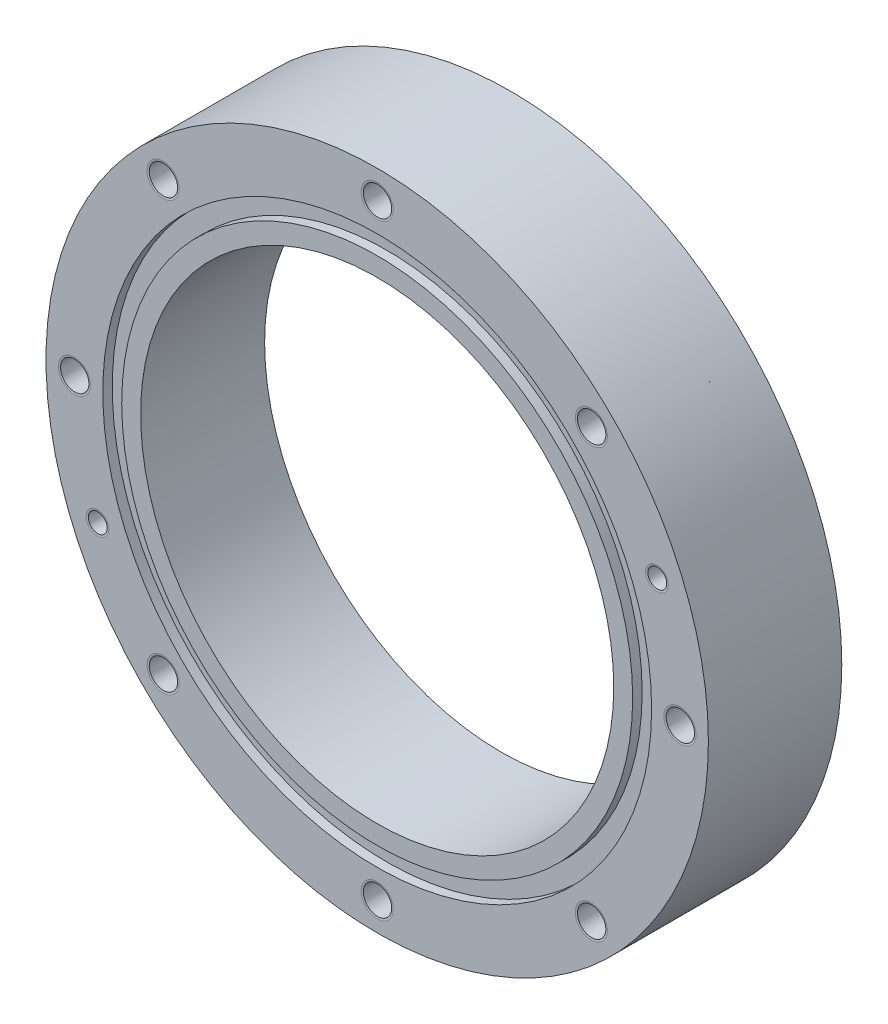
ISO-10303-21;
HEADER;
FILE_DESCRIPTION(('STEP AP214'),'2;1');
FILE_NAME('part.step','',(''),(''),'','','');
FILE_SCHEMA(('AUTOMOTIVE_DESIGN { 1 0 10303 214 1 1 1 1 }'));
ENDSEC;
DATA;
#1=APPLICATION_CONTEXT('core data for automotive mechanical design processes');
#2=APPLICATION_PROTOCOL_DEFINITION('international standard','automotive_design',2000,#1);
#3=PRODUCT_CONTEXT('',#1,'mechanical');
#4=PRODUCT('Part','Part','',(#3));
#5=PRODUCT_RELATED_PRODUCT_CATEGORY('part','',(#4));
#6=PRODUCT_DEFINITION_FORMATION('','',#4);
#7=PRODUCT_DEFINITION_CONTEXT('part definition',#1,'design');
#8=PRODUCT_DEFINITION('design','',#6,#7);
#9=PRODUCT_DEFINITION_SHAPE('','',#8);
#10=(LENGTH_UNIT() NAMED_UNIT(*) SI_UNIT(.MILLI.,.METRE.));
#11=(NAMED_UNIT(*) PLANE_ANGLE_UNIT() SI_UNIT($,.RADIAN.));
#12=(NAMED_UNIT(*) SI_UNIT($,.STERADIAN.) SOLID_ANGLE_UNIT());
#13=UNCERTAINTY_MEASURE_WITH_UNIT(LENGTH_MEASURE(1.E-05),#10,'distance_accuracy_value','');
#14=(GEOMETRIC_REPRESENTATION_CONTEXT(3) GLOBAL_UNCERTAINTY_ASSIGNED_CONTEXT((#13)) GLOBAL_UNIT_ASSIGNED_CONTEXT((#10,
#11,#12)) REPRESENTATION_CONTEXT('',''));
#15=CARTESIAN_POINT('',(0.,0.,0.));
#16=DIRECTION('',(0.,0.,1.));
#17=DIRECTION('',(1.,0.,0.));
#18=AXIS2_PLACEMENT_3D('',#15,#16,#17);
#19=CARTESIAN_POINT('',(0.,0.,14.1));
#20=DIRECTION('',(0.,0.,1.));
#21=DIRECTION('',(1.,0.,0.));
#22=AXIS2_PLACEMENT_3D('',#19,#20,#21);
#23=PLANE('',#22);
#24=CARTESIAN_POINT('',(0.,0.,14.1));
#25=DIRECTION('',(0.,0.,1.));
#26=DIRECTION('',(1.,0.,0.));
#27=AXIS2_PLACEMENT_3D('',#24,#25,#26);
#28=CIRCLE('',#27,25.);
#29=CARTESIAN_POINT('',(25.,0.,14.1));
#30=VERTEX_POINT('',#29);
#31=EDGE_CURVE('E58',#30,#30,#28,.T.);
#32=ORIENTED_EDGE('',*,*,#31,.F.);
#33=EDGE_LOOP('',(#32));
#34=FACE_BOUND('',#33,.T.);
#35=CARTESIAN_POINT('',(0.,0.,14.1));
#36=DIRECTION('',(0.,0.,1.));
#37=DIRECTION('',(1.,0.,0.));
#38=AXIS2_PLACEMENT_3D('',#35,#36,#37);
#39=CIRCLE('',#38,27.);
#40=CARTESIAN_POINT('',(27.,0.,14.1));
#41=VERTEX_POINT('',#40);
#42=EDGE_CURVE('E96',#41,#41,#39,.T.);
#43=ORIENTED_EDGE('',*,*,#42,.T.);
#44=EDGE_LOOP('',(#43));
#45=FACE_BOUND('',#44,.T.);
#46=ADVANCED_FACE('F43',(#34,#45),#23,.T.);
#47=CARTESIAN_POINT('',(29.5641450403612,12.2458698356829,14.1));
#48=DIRECTION('',(0.,0.,1.));
#49=DIRECTION('',(1.,0.,0.));
#50=AXIS2_PLACEMENT_3D('',#47,#48,#49);
#51=CIRCLE('',#50,1.2);
#52=CARTESIAN_POINT('',(30.7641450403612,12.2458698356829,14.1));
#53=VERTEX_POINT('',#52);
#54=EDGE_CURVE('E133',#53,#53,#51,.T.);
#55=ORIENTED_EDGE('',*,*,#54,.F.);
#56=EDGE_LOOP('',(#55));
#57=FACE_BOUND('',#56,.T.);
#58=CARTESIAN_POINT('',(-29.5641450403612,-12.2458698356829,14.1));
#59=DIRECTION('',(0.,0.,1.));
#60=DIRECTION('',(1.,0.,0.));
#61=AXIS2_PLACEMENT_3D('',#58,#59,#60);
#62=CIRCLE('',#61,1.2);
#63=CARTESIAN_POINT('',(-28.3641450403612,-12.2458698356829,14.1));
#64=VERTEX_POINT('',#63);
#65=EDGE_CURVE('E141',#64,#64,#62,.T.);
#66=ORIENTED_EDGE('',*,*,#65,.F.);
#67=EDGE_LOOP('',(#66));
#68=FACE_BOUND('',#67,.T.);
#69=CARTESIAN_POINT('',(1.18948411698704E-12,32.0000000000019,14.1));
#70=DIRECTION('',(0.,0.,1.));
#71=DIRECTION('',(1.,0.,0.));
#72=AXIS2_PLACEMENT_3D('',#69,#70,#71);
#73=CIRCLE('',#72,1.7);
#74=CARTESIAN_POINT('',(1.70000000000119,32.0000000000019,14.1));
#75=VERTEX_POINT('',#74);
#76=EDGE_CURVE('E102',#75,#75,#73,.T.);
#77=ORIENTED_EDGE('',*,*,#76,.F.);
#78=EDGE_LOOP('',(#77));
#79=FACE_BOUND('',#78,.T.);
#80=CARTESIAN_POINT('',(22.6274169979718,22.62741699797,14.1));
#81=DIRECTION('',(0.,0.,1.));
#82=DIRECTION('',(1.,0.,0.));
#83=AXIS2_PLACEMENT_3D('',#80,#81,#82);
#84=CIRCLE('',#83,1.7);
#85=CARTESIAN_POINT('',(24.3274169979718,22.62741699797,14.1));
#86=VERTEX_POINT('',#85);
#87=EDGE_CURVE('E160',#86,#86,#84,.T.);
#88=ORIENTED_EDGE('',*,*,#87,.F.);
#89=EDGE_LOOP('',(#88));
#90=FACE_BOUND('',#89,.T.);
#91=CARTESIAN_POINT('',(32.0000000000019,-1.30815041373393E-12,14.1));
#92=DIRECTION('',(0.,0.,1.));
#93=DIRECTION('',(1.,0.,0.));
#94=AXIS2_PLACEMENT_3D('',#91,#92,#93);
#95=CIRCLE('',#94,1.7);
#96=CARTESIAN_POINT('',(33.7000000000019,-1.30815041373393E-12,14.1));
#97=VERTEX_POINT('',#96);
#98=EDGE_CURVE('E164',#97,#97,#95,.T.);
#99=ORIENTED_EDGE('',*,*,#98,.F.);
#100=EDGE_LOOP('',(#99));
#101=FACE_BOUND('',#100,.T.);
#102=CARTESIAN_POINT('',(22.6274169979699,-22.6274169979718,14.1));
#103=DIRECTION('',(0.,0.,1.));
#104=DIRECTION('',(1.,0.,0.));
#105=AXIS2_PLACEMENT_3D('',#102,#103,#104);
#106=CIRCLE('',#105,1.7);
#107=CARTESIAN_POINT('',(24.3274169979699,-22.6274169979718,14.1));
#108=VERTEX_POINT('',#107);
#109=EDGE_CURVE('E168',#108,#108,#106,.T.);
#110=ORIENTED_EDGE('',*,*,#109,.F.);
#111=EDGE_LOOP('',(#110));
#112=FACE_BOUND('',#111,.T.);
#113=CARTESIAN_POINT('',(-1.41293892267301E-12,-32.0000000000019,14.1));
#114=DIRECTION('',(0.,0.,1.));
#115=DIRECTION('',(1.,0.,0.));
#116=AXIS2_PLACEMENT_3D('',#113,#114,#115);
#117=CIRCLE('',#116,1.7);
#118=CARTESIAN_POINT('',(1.69999999999859,-32.0000000000019,14.1));
#119=VERTEX_POINT('',#118);
#120=EDGE_CURVE('E172',#119,#119,#117,.T.);
#121=ORIENTED_EDGE('',*,*,#120,.F.);
#122=EDGE_LOOP('',(#121));
#123=FACE_BOUND('',#122,.T.);
#124=CARTESIAN_POINT('',(-22.6274169979719,-22.6274169979698,14.1));
#125=DIRECTION('',(0.,0.,1.));
#126=DIRECTION('',(1.,0.,0.));
#127=AXIS2_PLACEMENT_3D('',#124,#125,#126);
#128=CIRCLE('',#127,1.7);
#129=CARTESIAN_POINT('',(-20.9274169979719,-22.6274169979698,14.1));
#130=VERTEX_POINT('',#129);
#131=EDGE_CURVE('E176',#130,#130,#128,.T.);
#132=ORIENTED_EDGE('',*,*,#131,.F.);
#133=EDGE_LOOP('',(#132));
#134=FACE_BOUND('',#133,.T.);
#135=CARTESIAN_POINT('',(-32.0000000000019,1.53160521941991E-12,14.1));
#136=DIRECTION('',(0.,0.,1.));
#137=DIRECTION('',(1.,0.,0.));
#138=AXIS2_PLACEMENT_3D('',#135,#136,#137);
#139=CIRCLE('',#138,1.7);
#140=CARTESIAN_POINT('',(-30.3000000000019,1.53160521941991E-12,14.1));
#141=VERTEX_POINT('',#140);
#142=EDGE_CURVE('E180',#141,#141,#139,.T.);
#143=ORIENTED_EDGE('',*,*,#142,.F.);
#144=EDGE_LOOP('',(#143));
#145=FACE_BOUND('',#144,.T.);
#146=CARTESIAN_POINT('',(-22.6274169979698,22.627416997972,14.1));
#147=DIRECTION('',(0.,0.,1.));
#148=DIRECTION('',(1.,0.,0.));
#149=AXIS2_PLACEMENT_3D('',#146,#147,#148);
#150=CIRCLE('',#149,1.7);
#151=CARTESIAN_POINT('',(-20.9274169979698,22.627416997972,14.1));
#152=VERTEX_POINT('',#151);
#153=EDGE_CURVE('E153',#152,#152,#150,.T.);
#154=ORIENTED_EDGE('',*,*,#153,.F.);
#155=EDGE_LOOP('',(#154));
#156=FACE_BOUND('',#155,.T.);
#157=CARTESIAN_POINT('',(0.,0.,14.1));
#158=DIRECTION('',(0.,0.,1.));
#159=DIRECTION('',(1.,0.,0.));
#160=AXIS2_PLACEMENT_3D('',#157,#158,#159);
#161=CIRCLE('',#160,29.);
#162=CARTESIAN_POINT('',(29.,0.,14.1));
#163=VERTEX_POINT('',#162);
#164=EDGE_CURVE('E221',#163,#163,#161,.T.);
#165=ORIENTED_EDGE('',*,*,#164,.F.);
#166=EDGE_LOOP('',(#165));
#167=FACE_BOUND('',#166,.T.);
#168=CARTESIAN_POINT('',(0.,0.,14.1));
#169=DIRECTION('',(0.,0.,1.));
#170=DIRECTION('',(1.,0.,0.));
#171=AXIS2_PLACEMENT_3D('',#168,#169,#170);
#172=CIRCLE('',#171,35.);
#173=CARTESIAN_POINT('',(35.,0.,14.1));
#174=VERTEX_POINT('',#173);
#175=EDGE_CURVE('E10',#174,#174,#172,.T.);
#176=ORIENTED_EDGE('',*,*,#175,.T.);
#177=EDGE_LOOP('',(#176));
#178=FACE_BOUND('',#177,.T.);
#179=ADVANCED_FACE('F248',(#57,#68,#79,#90,#101,#112,#123,#134,#145,#156,#167,#178),#23,.T.);
#180=CARTESIAN_POINT('',(0.,0.,0.));
#181=DIRECTION('',(0.,0.,1.));
#182=DIRECTION('',(1.,0.,0.));
#183=AXIS2_PLACEMENT_3D('',#180,#181,#182);
#184=PLANE('',#183);
#185=CARTESIAN_POINT('',(1.18948411698704E-12,32.0000000000019,0.));
#186=DIRECTION('',(0.,0.,-1.));
#187=DIRECTION('',(-1.,0.,0.));
#188=AXIS2_PLACEMENT_3D('',#185,#186,#187);
#189=CIRCLE('',#188,1.7);
#190=CARTESIAN_POINT('',(-1.69999999999881,32.0000000000019,0.));
#191=VERTEX_POINT('',#190);
#192=EDGE_CURVE('E68',#191,#191,#189,.T.);
#193=ORIENTED_EDGE('',*,*,#192,.F.);
#194=EDGE_LOOP('',(#193));
#195=FACE_BOUND('',#194,.T.);
#196=CARTESIAN_POINT('',(-22.6274169979701,22.6274169979717,0.));
#197=DIRECTION('',(0.,0.,-1.));
#198=DIRECTION('',(-1.,0.,0.));
#199=AXIS2_PLACEMENT_3D('',#196,#197,#198);
#200=CIRCLE('',#199,1.7);
#201=CARTESIAN_POINT('',(-24.3274169979701,22.6274169979717,0.));
#202=VERTEX_POINT('',#201);
#203=EDGE_CURVE('E190',#202,#202,#200,.T.);
#204=ORIENTED_EDGE('',*,*,#203,.F.);
#205=EDGE_LOOP('',(#204));
#206=FACE_BOUND('',#205,.T.);
#207=CARTESIAN_POINT('',(-32.0000000000019,1.07775671414405E-12,0.));
#208=DIRECTION('',(0.,0.,-1.));
#209=DIRECTION('',(-1.,0.,0.));
#210=AXIS2_PLACEMENT_3D('',#207,#208,#209);
#211=CIRCLE('',#210,1.7);
#212=CARTESIAN_POINT('',(-33.7000000000019,1.07775671414405E-12,0.));
#213=VERTEX_POINT('',#212);
#214=EDGE_CURVE('E194',#213,#213,#211,.T.);
#215=ORIENTED_EDGE('',*,*,#214,.F.);
#216=EDGE_LOOP('',(#215));
#217=FACE_BOUND('',#216,.T.);
#218=CARTESIAN_POINT('',(-22.6274169979716,-22.6274169979702,0.));
#219=DIRECTION('',(0.,0.,-1.));
#220=DIRECTION('',(-1.,0.,0.));
#221=AXIS2_PLACEMENT_3D('',#218,#219,#220);
#222=CIRCLE('',#221,1.7);
#223=CARTESIAN_POINT('',(-24.3274169979716,-22.6274169979702,0.));
#224=VERTEX_POINT('',#223);
#225=EDGE_CURVE('E198',#224,#224,#222,.T.);
#226=ORIENTED_EDGE('',*,*,#225,.F.);
#227=EDGE_LOOP('',(#226));
#228=FACE_BOUND('',#227,.T.);
#229=CARTESIAN_POINT('',(-9.66029311301066E-13,-32.0000000000019,0.));
#230=DIRECTION('',(0.,0.,-1.));
#231=DIRECTION('',(-1.,0.,0.));
#232=AXIS2_PLACEMENT_3D('',#229,#230,#231);
#233=CIRCLE('',#232,1.7);
#234=CARTESIAN_POINT('',(-1.70000000000096,-32.0000000000019,0.));
#235=VERTEX_POINT('',#234);
#236=EDGE_CURVE('E202',#235,#235,#233,.T.);
#237=ORIENTED_EDGE('',*,*,#236,.F.);
#238=EDGE_LOOP('',(#237));
#239=FACE_BOUND('',#238,.T.);
#240=CARTESIAN_POINT('',(22.6274169979702,-22.6274169979715,0.));
#241=DIRECTION('',(0.,0.,-1.));
#242=DIRECTION('',(-1.,0.,0.));
#243=AXIS2_PLACEMENT_3D('',#240,#241,#242);
#244=CIRCLE('',#243,1.7);
#245=CARTESIAN_POINT('',(20.9274169979702,-22.6274169979715,0.));
#246=VERTEX_POINT('',#245);
#247=EDGE_CURVE('E206',#246,#246,#244,.T.);
#248=ORIENTED_EDGE('',*,*,#247,.F.);
#249=EDGE_LOOP('',(#248));
#250=FACE_BOUND('',#249,.T.);
#251=CARTESIAN_POINT('',(32.0000000000019,-8.54301908458079E-13,0.));
#252=DIRECTION('',(0.,0.,-1.));
#253=DIRECTION('',(-1.,0.,0.));
#254=AXIS2_PLACEMENT_3D('',#251,#252,#253);
#255=CIRCLE('',#254,1.7);
#256=CARTESIAN_POINT('',(30.3000000000019,-8.54301908458079E-13,0.));
#257=VERTEX_POINT('',#256);
#258=EDGE_CURVE('E210',#257,#257,#255,.T.);
#259=ORIENTED_EDGE('',*,*,#258,.F.);
#260=EDGE_LOOP('',(#259));
#261=FACE_BOUND('',#260,.T.);
#262=CARTESIAN_POINT('',(22.6274169979714,22.6274169979703,0.));
#263=DIRECTION('',(0.,0.,-1.));
#264=DIRECTION('',(-1.,0.,0.));
#265=AXIS2_PLACEMENT_3D('',#262,#263,#264);
#266=CIRCLE('',#265,1.7);
#267=CARTESIAN_POINT('',(20.9274169979714,22.6274169979703,0.));
#268=VERTEX_POINT('',#267);
#269=EDGE_CURVE('E129',#268,#268,#266,.T.);
#270=ORIENTED_EDGE('',*,*,#269,.F.);
#271=EDGE_LOOP('',(#270));
#272=FACE_BOUND('',#271,.T.);
#273=CARTESIAN_POINT('',(0.,0.,0.));
#274=DIRECTION('',(0.,0.,1.));
#275=DIRECTION('',(1.,0.,0.));
#276=AXIS2_PLACEMENT_3D('',#273,#274,#275);
#277=CIRCLE('',#276,35.);
#278=CARTESIAN_POINT('',(35.,0.,0.));
#279=VERTEX_POINT('',#278);
#280=EDGE_CURVE('E52',#279,#279,#277,.T.);
#281=ORIENTED_EDGE('',*,*,#280,.F.);
#282=EDGE_LOOP('',(#281));
#283=FACE_BOUND('',#282,.T.);
#284=CARTESIAN_POINT('',(0.,0.,0.));
#285=DIRECTION('',(0.,0.,-1.));
#286=DIRECTION('',(-1.,0.,0.));
#287=AXIS2_PLACEMENT_3D('',#284,#285,#286);
#288=CIRCLE('',#287,29.);
#289=CARTESIAN_POINT('',(-29.,0.,0.));
#290=VERTEX_POINT('',#289);
#291=EDGE_CURVE('E229',#290,#290,#288,.T.);
#292=ORIENTED_EDGE('',*,*,#291,.F.);
#293=EDGE_LOOP('',(#292));
#294=FACE_BOUND('',#293,.T.);
#295=ADVANCED_FACE('F313',(#195,#206,#217,#228,#239,#250,#261,#272,#283,#294),#184,.F.);
#296=CARTESIAN_POINT('',(0.,0.,14.1));
#297=DIRECTION('',(0.,0.,-1.));
#298=DIRECTION('',(-1.,0.,0.));
#299=AXIS2_PLACEMENT_3D('',#296,#297,#298);
#300=CYLINDRICAL_SURFACE('',#299,35.);
#301=ORIENTED_EDGE('',*,*,#175,.F.);
#302=EDGE_LOOP('',(#301));
#303=FACE_BOUND('',#302,.T.);
#304=ORIENTED_EDGE('',*,*,#280,.T.);
#305=EDGE_LOOP('',(#304));
#306=FACE_BOUND('',#305,.T.);
#307=ADVANCED_FACE('F45',(#303,#306),#300,.T.);
#308=CARTESIAN_POINT('',(1.18948411698704E-12,32.0000000000019,14.1));
#309=DIRECTION('',(0.,0.,-1.));
#310=DIRECTION('',(-1.,0.,0.));
#311=AXIS2_PLACEMENT_3D('',#308,#309,#310);
#312=CYLINDRICAL_SURFACE('',#311,1.4999999999983);
#313=CARTESIAN_POINT('',(1.18948411698704E-12,32.0000000000019,14.064734603858));
#314=DIRECTION('',(0.,0.,1.));
#315=DIRECTION('',(1.,0.,0.));
#316=AXIS2_PLACEMENT_3D('',#313,#314,#315);
#317=CIRCLE('',#316,1.4999999999983);
#318=CARTESIAN_POINT('',(1.49999999999949,32.0000000000019,14.064734603858));
#319=VERTEX_POINT('',#318);
#320=EDGE_CURVE('E126',#319,#319,#317,.F.);
#321=ORIENTED_EDGE('',*,*,#320,.F.);
#322=EDGE_LOOP('',(#321));
#323=FACE_BOUND('',#322,.T.);
#324=CARTESIAN_POINT('',(1.18948411698704E-12,32.0000000000019,0.0352653961419922));
#325=DIRECTION('',(0.,0.,-1.));
#326=DIRECTION('',(-1.,0.,0.));
#327=AXIS2_PLACEMENT_3D('',#324,#325,#326);
#328=CIRCLE('',#327,1.4999999999983);
#329=CARTESIAN_POINT('',(-1.49999999999711,32.0000000000019,0.0352653961419922));
#330=VERTEX_POINT('',#329);
#331=EDGE_CURVE('E92',#330,#330,#328,.F.);
#332=ORIENTED_EDGE('',*,*,#331,.F.);
#333=EDGE_LOOP('',(#332));
#334=FACE_BOUND('',#333,.T.);
#335=ADVANCED_FACE('F308',(#323,#334),#312,.F.);
#336=CARTESIAN_POINT('',(22.6274169979725,22.627416997972,14.1));
#337=DIRECTION('',(0.,0.,-1.));
#338=DIRECTION('',(-1.,0.,0.));
#339=AXIS2_PLACEMENT_3D('',#336,#337,#338);
#340=CYLINDRICAL_SURFACE('',#339,1.49999999999856);
#341=CARTESIAN_POINT('',(22.6274169979718,22.62741699797,14.0647346038581));
#342=DIRECTION('',(0.,0.,1.));
#343=DIRECTION('',(1.,0.,0.));
#344=AXIS2_PLACEMENT_3D('',#341,#342,#343);
#345=CIRCLE('',#344,1.49999999999856);
#346=CARTESIAN_POINT('',(24.1274169979703,22.62741699797,14.0647346038581));
#347=VERTEX_POINT('',#346);
#348=EDGE_CURVE('E122',#347,#347,#345,.F.);
#349=ORIENTED_EDGE('',*,*,#348,.F.);
#350=EDGE_LOOP('',(#349));
#351=FACE_BOUND('',#350,.T.);
#352=CARTESIAN_POINT('',(22.6274169979714,22.6274169979703,0.0352653961419469));
#353=DIRECTION('',(0.,0.,-1.));
#354=DIRECTION('',(-1.,0.,0.));
#355=AXIS2_PLACEMENT_3D('',#352,#353,#354);
#356=CIRCLE('',#355,1.49999999999856);
#357=CARTESIAN_POINT('',(21.1274169979729,22.6274169979703,0.0352653961419469));
#358=VERTEX_POINT('',#357);
#359=EDGE_CURVE('E88',#358,#358,#356,.F.);
#360=ORIENTED_EDGE('',*,*,#359,.F.);
#361=EDGE_LOOP('',(#360));
#362=FACE_BOUND('',#361,.T.);
#363=ADVANCED_FACE('F304',(#351,#362),#340,.F.);
#364=CARTESIAN_POINT('',(32.0000000000046,1.53312168369584E-12,14.1));
#365=DIRECTION('',(0.,0.,-1.));
#366=DIRECTION('',(-1.,0.,0.));
#367=AXIS2_PLACEMENT_3D('',#364,#365,#366);
#368=CYLINDRICAL_SURFACE('',#367,1.50000000000022);
#369=CARTESIAN_POINT('',(32.0000000000019,-1.30815041373393E-12,14.0647346038583));
#370=DIRECTION('',(0.,0.,1.));
#371=DIRECTION('',(1.,0.,0.));
#372=AXIS2_PLACEMENT_3D('',#369,#370,#371);
#373=CIRCLE('',#372,1.50000000000022);
#374=CARTESIAN_POINT('',(33.5000000000021,-1.30815041373393E-12,14.0647346038583));
#375=VERTEX_POINT('',#374);
#376=EDGE_CURVE('E118',#375,#375,#373,.F.);
#377=ORIENTED_EDGE('',*,*,#376,.F.);
#378=EDGE_LOOP('',(#377));
#379=FACE_BOUND('',#378,.T.);
#380=CARTESIAN_POINT('',(32.0000000000019,-8.54301908458079E-13,0.0352653961416548));
#381=DIRECTION('',(0.,0.,-1.));
#382=DIRECTION('',(-1.,0.,0.));
#383=AXIS2_PLACEMENT_3D('',#380,#381,#382);
#384=CIRCLE('',#383,1.50000000000022);
#385=CARTESIAN_POINT('',(30.5000000000017,-8.54301908458079E-13,0.0352653961416548));
#386=VERTEX_POINT('',#385);
#387=EDGE_CURVE('E84',#386,#386,#384,.F.);
#388=ORIENTED_EDGE('',*,*,#387,.F.);
#389=EDGE_LOOP('',(#388));
#390=FACE_BOUND('',#389,.T.);
#391=ADVANCED_FACE('F300',(#379,#390),#368,.F.);
#392=CARTESIAN_POINT('',(22.6274169979747,-22.6274169979698,14.1));
#393=DIRECTION('',(0.,0.,-1.));
#394=DIRECTION('',(-1.,0.,0.));
#395=AXIS2_PLACEMENT_3D('',#392,#393,#394);
#396=CYLINDRICAL_SURFACE('',#395,1.50000000000234);
#397=CARTESIAN_POINT('',(22.6274169979699,-22.6274169979718,14.0647346038587));
#398=DIRECTION('',(0.,0.,1.));
#399=DIRECTION('',(1.,0.,0.));
#400=AXIS2_PLACEMENT_3D('',#397,#398,#399);
#401=CIRCLE('',#400,1.50000000000234);
#402=CARTESIAN_POINT('',(24.1274169979723,-22.6274169979718,14.0647346038587));
#403=VERTEX_POINT('',#402);
#404=EDGE_CURVE('E114',#403,#403,#401,.F.);
#405=ORIENTED_EDGE('',*,*,#404,.F.);
#406=EDGE_LOOP('',(#405));
#407=FACE_BOUND('',#406,.T.);
#408=CARTESIAN_POINT('',(22.6274169979702,-22.6274169979715,0.0352653961412789));
#409=DIRECTION('',(0.,0.,-1.));
#410=DIRECTION('',(-1.,0.,0.));
#411=AXIS2_PLACEMENT_3D('',#408,#409,#410);
#412=CIRCLE('',#411,1.50000000000234);
#413=CARTESIAN_POINT('',(21.1274169979679,-22.6274169979715,0.0352653961412789));
#414=VERTEX_POINT('',#413);
#415=EDGE_CURVE('E80',#414,#414,#412,.F.);
#416=ORIENTED_EDGE('',*,*,#415,.F.);
#417=EDGE_LOOP('',(#416));
#418=FACE_BOUND('',#417,.T.);
#419=ADVANCED_FACE('F296',(#407,#418),#396,.F.);
#420=CARTESIAN_POINT('',(4.25572748437872E-12,-32.0000000000019,14.1));
#421=DIRECTION('',(0.,0.,-1.));
#422=DIRECTION('',(-1.,0.,0.));
#423=AXIS2_PLACEMENT_3D('',#420,#421,#422);
#424=CYLINDRICAL_SURFACE('',#423,1.50000000000372);
#425=CARTESIAN_POINT('',(-1.41293892267301E-12,-32.0000000000019,14.064734603859));
#426=DIRECTION('',(0.,0.,1.));
#427=DIRECTION('',(1.,0.,0.));
#428=AXIS2_PLACEMENT_3D('',#425,#426,#427);
#429=CIRCLE('',#428,1.50000000000372);
#430=CARTESIAN_POINT('',(1.50000000000231,-32.0000000000019,14.064734603859));
#431=VERTEX_POINT('',#430);
#432=EDGE_CURVE('E110',#431,#431,#429,.F.);
#433=ORIENTED_EDGE('',*,*,#432,.F.);
#434=EDGE_LOOP('',(#433));
#435=FACE_BOUND('',#434,.T.);
#436=CARTESIAN_POINT('',(-9.66029311301066E-13,-32.0000000000019,0.035265396141036));
#437=DIRECTION('',(0.,0.,-1.));
#438=DIRECTION('',(-1.,0.,0.));
#439=AXIS2_PLACEMENT_3D('',#436,#437,#438);
#440=CIRCLE('',#439,1.50000000000372);
#441=CARTESIAN_POINT('',(-1.50000000000469,-32.0000000000019,0.035265396141036));
#442=VERTEX_POINT('',#441);
#443=EDGE_CURVE('E76',#442,#442,#440,.F.);
#444=ORIENTED_EDGE('',*,*,#443,.F.);
#445=EDGE_LOOP('',(#444));
#446=FACE_BOUND('',#445,.T.);
#447=ADVANCED_FACE('F292',(#435,#446),#424,.F.);
#448=CARTESIAN_POINT('',(-22.6274169979671,-22.627416997972,14.1));
#449=DIRECTION('',(0.,0.,-1.));
#450=DIRECTION('',(-1.,0.,0.));
#451=AXIS2_PLACEMENT_3D('',#448,#449,#450);
#452=CYLINDRICAL_SURFACE('',#451,1.50000000000358);
#453=CARTESIAN_POINT('',(-22.6274169979719,-22.6274169979698,14.0647346038589));
#454=DIRECTION('',(0.,0.,1.));
#455=DIRECTION('',(1.,0.,0.));
#456=AXIS2_PLACEMENT_3D('',#453,#454,#455);
#457=CIRCLE('',#456,1.50000000000358);
#458=CARTESIAN_POINT('',(-21.1274169979683,-22.6274169979698,14.0647346038589));
#459=VERTEX_POINT('',#458);
#460=EDGE_CURVE('E106',#459,#459,#457,.F.);
#461=ORIENTED_EDGE('',*,*,#460,.F.);
#462=EDGE_LOOP('',(#461));
#463=FACE_BOUND('',#462,.T.);
#464=CARTESIAN_POINT('',(-22.6274169979716,-22.6274169979702,0.0352653961410613));
#465=DIRECTION('',(0.,0.,-1.));
#466=DIRECTION('',(-1.,0.,0.));
#467=AXIS2_PLACEMENT_3D('',#464,#465,#466);
#468=CIRCLE('',#467,1.50000000000358);
#469=CARTESIAN_POINT('',(-24.1274169979752,-22.6274169979702,0.0352653961410613));
#470=VERTEX_POINT('',#469);
#471=EDGE_CURVE('E72',#470,#470,#468,.F.);
#472=ORIENTED_EDGE('',*,*,#471,.F.);
#473=EDGE_LOOP('',(#472));
#474=FACE_BOUND('',#473,.T.);
#475=ADVANCED_FACE('F288',(#463,#474),#452,.F.);
#476=CARTESIAN_POINT('',(-31.9999999999992,-1.53704055345311E-12,14.1));
#477=DIRECTION('',(0.,0.,-1.));
#478=DIRECTION('',(-1.,0.,0.));
#479=AXIS2_PLACEMENT_3D('',#476,#477,#478);
#480=CYLINDRICAL_SURFACE('',#479,1.50000000000202);
#481=CARTESIAN_POINT('',(-32.0000000000019,1.53160521941991E-12,14.0647346038587));
#482=DIRECTION('',(0.,0.,1.));
#483=DIRECTION('',(1.,0.,0.));
#484=AXIS2_PLACEMENT_3D('',#481,#482,#483);
#485=CIRCLE('',#484,1.50000000000202);
#486=CARTESIAN_POINT('',(-30.4999999999999,1.53160521941991E-12,14.0647346038587));
#487=VERTEX_POINT('',#486);
#488=EDGE_CURVE('E101',#487,#487,#485,.F.);
#489=ORIENTED_EDGE('',*,*,#488,.F.);
#490=EDGE_LOOP('',(#489));
#491=FACE_BOUND('',#490,.T.);
#492=CARTESIAN_POINT('',(-32.0000000000019,1.07775671414405E-12,0.0352653961413359));
#493=DIRECTION('',(0.,0.,-1.));
#494=DIRECTION('',(-1.,0.,0.));
#495=AXIS2_PLACEMENT_3D('',#492,#493,#494);
#496=CIRCLE('',#495,1.50000000000202);
#497=CARTESIAN_POINT('',(-33.5000000000039,1.07775671414405E-12,0.0352653961413359));
#498=VERTEX_POINT('',#497);
#499=EDGE_CURVE('E67',#498,#498,#496,.F.);
#500=ORIENTED_EDGE('',*,*,#499,.F.);
#501=EDGE_LOOP('',(#500));
#502=FACE_BOUND('',#501,.T.);
#503=ADVANCED_FACE('F284',(#491,#502),#480,.F.);
#504=CARTESIAN_POINT('',(-22.6274169979692,22.6274169979698,14.1));
#505=DIRECTION('',(0.,0.,-1.));
#506=DIRECTION('',(-1.,0.,0.));
#507=AXIS2_PLACEMENT_3D('',#504,#505,#506);
#508=CYLINDRICAL_SURFACE('',#507,1.5);
#509=CARTESIAN_POINT('',(-22.6274169979698,22.627416997972,14.0647346038583));
#510=DIRECTION('',(0.,0.,1.));
#511=DIRECTION('',(1.,0.,0.));
#512=AXIS2_PLACEMENT_3D('',#509,#510,#511);
#513=CIRCLE('',#512,1.5);
#514=CARTESIAN_POINT('',(-21.1274169979698,22.627416997972,14.0647346038583));
#515=VERTEX_POINT('',#514);
#516=EDGE_CURVE('E97',#515,#515,#513,.F.);
#517=ORIENTED_EDGE('',*,*,#516,.F.);
#518=EDGE_LOOP('',(#517));
#519=FACE_BOUND('',#518,.T.);
#520=CARTESIAN_POINT('',(-22.6274169979701,22.6274169979717,0.0352653961416922));
#521=DIRECTION('',(0.,0.,-1.));
#522=DIRECTION('',(-1.,0.,0.));
#523=AXIS2_PLACEMENT_3D('',#520,#521,#522);
#524=CIRCLE('',#523,1.5);
#525=CARTESIAN_POINT('',(-24.1274169979701,22.6274169979717,0.0352653961416922));
#526=VERTEX_POINT('',#525);
#527=EDGE_CURVE('E63',#526,#526,#524,.F.);
#528=ORIENTED_EDGE('',*,*,#527,.F.);
#529=EDGE_LOOP('',(#528));
#530=FACE_BOUND('',#529,.T.);
#531=ADVANCED_FACE('F281',(#519,#530),#508,.F.);
#532=CARTESIAN_POINT('',(0.,0.,11.));
#533=DIRECTION('',(0.,0.,1.));
#534=DIRECTION('',(1.,0.,0.));
#535=AXIS2_PLACEMENT_3D('',#532,#533,#534);
#536=CYLINDRICAL_SURFACE('',#535,25.);
#537=ORIENTED_EDGE('',*,*,#31,.T.);
#538=EDGE_LOOP('',(#537));
#539=FACE_BOUND('',#538,.T.);
#540=CARTESIAN_POINT('',(0.,0.,0.997312011372717));
#541=DIRECTION('',(0.,0.,-1.));
#542=DIRECTION('',(-1.,0.,0.));
#543=AXIS2_PLACEMENT_3D('',#540,#541,#542);
#544=CIRCLE('',#543,25.);
#545=CARTESIAN_POINT('',(-25.,0.,0.997312011372717));
#546=VERTEX_POINT('',#545);
#547=EDGE_CURVE('E235',#546,#546,#544,.T.);
#548=ORIENTED_EDGE('',*,*,#547,.T.);
#549=EDGE_LOOP('',(#548));
#550=FACE_BOUND('',#549,.T.);
#551=ADVANCED_FACE('F244',(#539,#550),#536,.F.);
#552=CARTESIAN_POINT('',(0.,0.,0.));
#553=DIRECTION('',(0.,0.,-1.));
#554=DIRECTION('',(-1.,0.,0.));
#555=AXIS2_PLACEMENT_3D('',#552,#553,#554);
#556=CONICAL_SURFACE('',#555,29.,1.32645023151569);
#557=ORIENTED_EDGE('',*,*,#291,.T.);
#558=EDGE_LOOP('',(#557));
#559=FACE_BOUND('',#558,.T.);
#560=ORIENTED_EDGE('',*,*,#547,.F.);
#561=EDGE_LOOP('',(#560));
#562=FACE_BOUND('',#561,.T.);
#563=ADVANCED_FACE('F274',(#559,#562),#556,.F.);
#564=CARTESIAN_POINT('',(0.,0.,13.1));
#565=DIRECTION('',(0.,0.,1.));
#566=DIRECTION('',(1.,0.,0.));
#567=AXIS2_PLACEMENT_3D('',#564,#565,#566);
#568=CYLINDRICAL_SURFACE('',#567,29.);
#569=CARTESIAN_POINT('',(0.,0.,13.1));
#570=DIRECTION('',(0.,0.,1.));
#571=DIRECTION('',(1.,0.,0.));
#572=AXIS2_PLACEMENT_3D('',#569,#570,#571);
#573=CIRCLE('',#572,29.);
#574=CARTESIAN_POINT('',(29.,0.,13.1));
#575=VERTEX_POINT('',#574);
#576=EDGE_CURVE('E225',#575,#575,#573,.T.);
#577=ORIENTED_EDGE('',*,*,#576,.F.);
#578=EDGE_LOOP('',(#577));
#579=FACE_BOUND('',#578,.T.);
#580=ORIENTED_EDGE('',*,*,#164,.T.);
#581=EDGE_LOOP('',(#580));
#582=FACE_BOUND('',#581,.T.);
#583=ADVANCED_FACE('F265',(#579,#582),#568,.F.);
#584=CARTESIAN_POINT('',(0.,0.,13.1));
#585=DIRECTION('',(0.,0.,1.));
#586=DIRECTION('',(1.,0.,0.));
#587=AXIS2_PLACEMENT_3D('',#584,#585,#586);
#588=PLANE('',#587);
#589=CARTESIAN_POINT('',(0.,0.,13.1));
#590=DIRECTION('',(0.,0.,1.));
#591=DIRECTION('',(1.,0.,0.));
#592=AXIS2_PLACEMENT_3D('',#589,#590,#591);
#593=CIRCLE('',#592,27.);
#594=CARTESIAN_POINT('',(27.,0.,13.1));
#595=VERTEX_POINT('',#594);
#596=EDGE_CURVE('E217',#595,#595,#593,.T.);
#597=ORIENTED_EDGE('',*,*,#596,.F.);
#598=EDGE_LOOP('',(#597));
#599=FACE_BOUND('',#598,.T.);
#600=ORIENTED_EDGE('',*,*,#576,.T.);
#601=EDGE_LOOP('',(#600));
#602=FACE_BOUND('',#601,.T.);
#603=ADVANCED_FACE('F255',(#599,#602),#588,.T.);
#604=CARTESIAN_POINT('',(0.,0.,13.1));
#605=DIRECTION('',(0.,0.,1.));
#606=DIRECTION('',(1.,0.,0.));
#607=AXIS2_PLACEMENT_3D('',#604,#605,#606);
#608=CYLINDRICAL_SURFACE('',#607,27.);
#609=ORIENTED_EDGE('',*,*,#596,.T.);
#610=EDGE_LOOP('',(#609));
#611=FACE_BOUND('',#610,.T.);
#612=ORIENTED_EDGE('',*,*,#42,.F.);
#613=EDGE_LOOP('',(#612));
#614=FACE_BOUND('',#613,.T.);
#615=ADVANCED_FACE('F252',(#611,#614),#608,.T.);
#616=CARTESIAN_POINT('',(-22.6274169979701,22.6274169979717,0.));
#617=DIRECTION('',(0.,0.,-1.));
#618=DIRECTION('',(-1.,0.,0.));
#619=AXIS2_PLACEMENT_3D('',#616,#617,#618);
#620=CONICAL_SURFACE('',#619,1.7,1.39626340159547);
#621=ORIENTED_EDGE('',*,*,#527,.T.);
#622=EDGE_LOOP('',(#621));
#623=FACE_BOUND('',#622,.T.);
#624=ORIENTED_EDGE('',*,*,#203,.T.);
#625=EDGE_LOOP('',(#624));
#626=FACE_BOUND('',#625,.T.);
#627=ADVANCED_FACE('F254',(#623,#626),#620,.F.);
#628=CARTESIAN_POINT('',(-32.0000000000019,1.07775671414405E-12,0.));
#629=DIRECTION('',(0.,0.,-1.));
#630=DIRECTION('',(-1.,0.,0.));
#631=AXIS2_PLACEMENT_3D('',#628,#629,#630);
#632=CONICAL_SURFACE('',#631,1.7,1.39626340159547);
#633=ORIENTED_EDGE('',*,*,#499,.T.);
#634=EDGE_LOOP('',(#633));
#635=FACE_BOUND('',#634,.T.);
#636=ORIENTED_EDGE('',*,*,#214,.T.);
#637=EDGE_LOOP('',(#636));
#638=FACE_BOUND('',#637,.T.);
#639=ADVANCED_FACE('F262',(#635,#638),#632,.F.);
#640=CARTESIAN_POINT('',(-22.6274169979716,-22.6274169979702,0.));
#641=DIRECTION('',(0.,0.,-1.));
#642=DIRECTION('',(-1.,0.,0.));
#643=AXIS2_PLACEMENT_3D('',#640,#641,#642);
#644=CONICAL_SURFACE('',#643,1.7,1.39626340159547);
#645=ORIENTED_EDGE('',*,*,#471,.T.);
#646=EDGE_LOOP('',(#645));
#647=FACE_BOUND('',#646,.T.);
#648=ORIENTED_EDGE('',*,*,#225,.T.);
#649=EDGE_LOOP('',(#648));
#650=FACE_BOUND('',#649,.T.);
#651=ADVANCED_FACE('F368',(#647,#650),#644,.F.);
#652=CARTESIAN_POINT('',(-9.66029311301066E-13,-32.0000000000019,0.));
#653=DIRECTION('',(0.,0.,-1.));
#654=DIRECTION('',(-1.,0.,0.));
#655=AXIS2_PLACEMENT_3D('',#652,#653,#654);
#656=CONICAL_SURFACE('',#655,1.7,1.39626340159547);
#657=ORIENTED_EDGE('',*,*,#443,.T.);
#658=EDGE_LOOP('',(#657));
#659=FACE_BOUND('',#658,.T.);
#660=ORIENTED_EDGE('',*,*,#236,.T.);
#661=EDGE_LOOP('',(#660));
#662=FACE_BOUND('',#661,.T.);
#663=ADVANCED_FACE('F361',(#659,#662),#656,.F.);
#664=CARTESIAN_POINT('',(22.6274169979702,-22.6274169979715,0.));
#665=DIRECTION('',(0.,0.,-1.));
#666=DIRECTION('',(-1.,0.,0.));
#667=AXIS2_PLACEMENT_3D('',#664,#665,#666);
#668=CONICAL_SURFACE('',#667,1.7,1.39626340159547);
#669=ORIENTED_EDGE('',*,*,#415,.T.);
#670=EDGE_LOOP('',(#669));
#671=FACE_BOUND('',#670,.T.);
#672=ORIENTED_EDGE('',*,*,#247,.T.);
#673=EDGE_LOOP('',(#672));
#674=FACE_BOUND('',#673,.T.);
#675=ADVANCED_FACE('F354',(#671,#674),#668,.F.);
#676=CARTESIAN_POINT('',(32.0000000000019,-8.54301908458079E-13,0.));
#677=DIRECTION('',(0.,0.,-1.));
#678=DIRECTION('',(-1.,0.,0.));
#679=AXIS2_PLACEMENT_3D('',#676,#677,#678);
#680=CONICAL_SURFACE('',#679,1.7,1.39626340159547);
#681=ORIENTED_EDGE('',*,*,#387,.T.);
#682=EDGE_LOOP('',(#681));
#683=FACE_BOUND('',#682,.T.);
#684=ORIENTED_EDGE('',*,*,#258,.T.);
#685=EDGE_LOOP('',(#684));
#686=FACE_BOUND('',#685,.T.);
#687=ADVANCED_FACE('F345',(#683,#686),#680,.F.);
#688=CARTESIAN_POINT('',(22.6274169979714,22.6274169979703,0.));
#689=DIRECTION('',(0.,0.,-1.));
#690=DIRECTION('',(-1.,0.,0.));
#691=AXIS2_PLACEMENT_3D('',#688,#689,#690);
#692=CONICAL_SURFACE('',#691,1.7,1.39626340159547);
#693=ORIENTED_EDGE('',*,*,#359,.T.);
#694=EDGE_LOOP('',(#693));
#695=FACE_BOUND('',#694,.T.);
#696=ORIENTED_EDGE('',*,*,#269,.T.);
#697=EDGE_LOOP('',(#696));
#698=FACE_BOUND('',#697,.T.);
#699=ADVANCED_FACE('F269',(#695,#698),#692,.F.);
#700=CARTESIAN_POINT('',(1.18948411698704E-12,32.0000000000019,0.));
#701=DIRECTION('',(0.,0.,-1.));
#702=DIRECTION('',(-1.,0.,0.));
#703=AXIS2_PLACEMENT_3D('',#700,#701,#702);
#704=CONICAL_SURFACE('',#703,1.7,1.39626340159547);
#705=ORIENTED_EDGE('',*,*,#331,.T.);
#706=EDGE_LOOP('',(#705));
#707=FACE_BOUND('',#706,.T.);
#708=ORIENTED_EDGE('',*,*,#192,.T.);
#709=EDGE_LOOP('',(#708));
#710=FACE_BOUND('',#709,.T.);
#711=ADVANCED_FACE('F344',(#707,#710),#704,.F.);
#712=CARTESIAN_POINT('',(-22.6274169979698,22.627416997972,14.1));
#713=DIRECTION('',(0.,0.,1.));
#714=DIRECTION('',(1.,0.,0.));
#715=AXIS2_PLACEMENT_3D('',#712,#713,#714);
#716=CONICAL_SURFACE('',#715,1.7,1.39626340159547);
#717=ORIENTED_EDGE('',*,*,#516,.T.);
#718=EDGE_LOOP('',(#717));
#719=FACE_BOUND('',#718,.T.);
#720=ORIENTED_EDGE('',*,*,#153,.T.);
#721=EDGE_LOOP('',(#720));
#722=FACE_BOUND('',#721,.T.);
#723=ADVANCED_FACE('F351',(#719,#722),#716,.F.);
#724=CARTESIAN_POINT('',(-32.0000000000019,1.53160521941991E-12,14.1));
#725=DIRECTION('',(0.,0.,1.));
#726=DIRECTION('',(1.,0.,0.));
#727=AXIS2_PLACEMENT_3D('',#724,#725,#726);
#728=CONICAL_SURFACE('',#727,1.7,1.39626340159547);
#729=ORIENTED_EDGE('',*,*,#488,.T.);
#730=EDGE_LOOP('',(#729));
#731=FACE_BOUND('',#730,.T.);
#732=ORIENTED_EDGE('',*,*,#142,.T.);
#733=EDGE_LOOP('',(#732));
#734=FACE_BOUND('',#733,.T.);
#735=ADVANCED_FACE('F378',(#731,#734),#728,.F.);
#736=CARTESIAN_POINT('',(-22.6274169979719,-22.6274169979698,14.1));
#737=DIRECTION('',(0.,0.,1.));
#738=DIRECTION('',(1.,0.,0.));
#739=AXIS2_PLACEMENT_3D('',#736,#737,#738);
#740=CONICAL_SURFACE('',#739,1.7,1.39626340159547);
#741=ORIENTED_EDGE('',*,*,#460,.T.);
#742=EDGE_LOOP('',(#741));
#743=FACE_BOUND('',#742,.T.);
#744=ORIENTED_EDGE('',*,*,#131,.T.);
#745=EDGE_LOOP('',(#744));
#746=FACE_BOUND('',#745,.T.);
#747=ADVANCED_FACE('F382',(#743,#746),#740,.F.);
#748=CARTESIAN_POINT('',(-1.41293892267301E-12,-32.0000000000019,14.1));
#749=DIRECTION('',(0.,0.,1.));
#750=DIRECTION('',(1.,0.,0.));
#751=AXIS2_PLACEMENT_3D('',#748,#749,#750);
#752=CONICAL_SURFACE('',#751,1.7,1.39626340159547);
#753=ORIENTED_EDGE('',*,*,#432,.T.);
#754=EDGE_LOOP('',(#753));
#755=FACE_BOUND('',#754,.T.);
#756=ORIENTED_EDGE('',*,*,#120,.T.);
#757=EDGE_LOOP('',(#756));
#758=FACE_BOUND('',#757,.T.);
#759=ADVANCED_FACE('F386',(#755,#758),#752,.F.);
#760=CARTESIAN_POINT('',(22.6274169979699,-22.6274169979718,14.1));
#761=DIRECTION('',(0.,0.,1.));
#762=DIRECTION('',(1.,0.,0.));
#763=AXIS2_PLACEMENT_3D('',#760,#761,#762);
#764=CONICAL_SURFACE('',#763,1.7,1.39626340159547);
#765=ORIENTED_EDGE('',*,*,#404,.T.);
#766=EDGE_LOOP('',(#765));
#767=FACE_BOUND('',#766,.T.);
#768=ORIENTED_EDGE('',*,*,#109,.T.);
#769=EDGE_LOOP('',(#768));
#770=FACE_BOUND('',#769,.T.);
#771=ADVANCED_FACE('F390',(#767,#770),#764,.F.);
#772=CARTESIAN_POINT('',(32.0000000000019,-1.30815041373393E-12,14.1));
#773=DIRECTION('',(0.,0.,1.));
#774=DIRECTION('',(1.,0.,0.));
#775=AXIS2_PLACEMENT_3D('',#772,#773,#774);
#776=CONICAL_SURFACE('',#775,1.7,1.39626340159547);
#777=ORIENTED_EDGE('',*,*,#376,.T.);
#778=EDGE_LOOP('',(#777));
#779=FACE_BOUND('',#778,.T.);
#780=ORIENTED_EDGE('',*,*,#98,.T.);
#781=EDGE_LOOP('',(#780));
#782=FACE_BOUND('',#781,.T.);
#783=ADVANCED_FACE('F394',(#779,#782),#776,.F.);
#784=CARTESIAN_POINT('',(22.6274169979718,22.62741699797,14.1));
#785=DIRECTION('',(0.,0.,1.));
#786=DIRECTION('',(1.,0.,0.));
#787=AXIS2_PLACEMENT_3D('',#784,#785,#786);
#788=CONICAL_SURFACE('',#787,1.7,1.39626340159547);
#789=ORIENTED_EDGE('',*,*,#348,.T.);
#790=EDGE_LOOP('',(#789));
#791=FACE_BOUND('',#790,.T.);
#792=ORIENTED_EDGE('',*,*,#87,.T.);
#793=EDGE_LOOP('',(#792));
#794=FACE_BOUND('',#793,.T.);
#795=ADVANCED_FACE('F398',(#791,#794),#788,.F.);
#796=CARTESIAN_POINT('',(1.18948411698704E-12,32.0000000000019,14.1));
#797=DIRECTION('',(0.,0.,1.));
#798=DIRECTION('',(1.,0.,0.));
#799=AXIS2_PLACEMENT_3D('',#796,#797,#798);
#800=CONICAL_SURFACE('',#799,1.7,1.39626340159547);
#801=ORIENTED_EDGE('',*,*,#320,.T.);
#802=EDGE_LOOP('',(#801));
#803=FACE_BOUND('',#802,.T.);
#804=ORIENTED_EDGE('',*,*,#76,.T.);
#805=EDGE_LOOP('',(#804));
#806=FACE_BOUND('',#805,.T.);
#807=ADVANCED_FACE('F402',(#803,#806),#800,.F.);
#808=CARTESIAN_POINT('',(29.5641450403612,12.2458698356829,14.1));
#809=DIRECTION('',(0.,0.,1.));
#810=DIRECTION('',(1.,0.,0.));
#811=AXIS2_PLACEMENT_3D('',#808,#809,#810);
#812=CONICAL_SURFACE('',#811,1.2,1.39626340159547);
#813=ORIENTED_EDGE('',*,*,#54,.T.);
#814=EDGE_LOOP('',(#813));
#815=FACE_BOUND('',#814,.T.);
#816=CARTESIAN_POINT('',(29.5641450403612,12.2458698356829,14.0647346038583));
#817=DIRECTION('',(0.,0.,1.));
#818=DIRECTION('',(1.,0.,0.));
#819=AXIS2_PLACEMENT_3D('',#816,#817,#818);
#820=CIRCLE('',#819,1.);
#821=CARTESIAN_POINT('',(30.5641450403612,12.2458698356829,14.0647346038583));
#822=VERTEX_POINT('',#821);
#823=EDGE_CURVE('E130',#822,#822,#820,.T.);
#824=ORIENTED_EDGE('',*,*,#823,.F.);
#825=EDGE_LOOP('',(#824));
#826=FACE_BOUND('',#825,.T.);
#827=ADVANCED_FACE('F406',(#815,#826),#812,.F.);
#828=CARTESIAN_POINT('',(-29.5641450403612,-12.2458698356829,14.1));
#829=DIRECTION('',(0.,0.,1.));
#830=DIRECTION('',(1.,0.,0.));
#831=AXIS2_PLACEMENT_3D('',#828,#829,#830);
#832=CONICAL_SURFACE('',#831,1.2,1.39626340159547);
#833=ORIENTED_EDGE('',*,*,#65,.T.);
#834=EDGE_LOOP('',(#833));
#835=FACE_BOUND('',#834,.T.);
#836=CARTESIAN_POINT('',(-29.5641450403612,-12.2458698356829,14.0647346038583));
#837=DIRECTION('',(0.,0.,1.));
#838=DIRECTION('',(1.,0.,0.));
#839=AXIS2_PLACEMENT_3D('',#836,#837,#838);
#840=CIRCLE('',#839,1.);
#841=CARTESIAN_POINT('',(-28.5641450403612,-12.2458698356829,14.0647346038583));
#842=VERTEX_POINT('',#841);
#843=EDGE_CURVE('E47',#842,#842,#840,.T.);
#844=ORIENTED_EDGE('',*,*,#843,.F.);
#845=EDGE_LOOP('',(#844));
#846=FACE_BOUND('',#845,.T.);
#847=ADVANCED_FACE('F422',(#835,#846),#832,.F.);
#848=CARTESIAN_POINT('',(29.5641450403612,12.2458698356829,10.1));
#849=DIRECTION('',(0.,0.,1.));
#850=DIRECTION('',(1.,0.,0.));
#851=AXIS2_PLACEMENT_3D('',#848,#849,#850);
#852=PLANE('',#851);
#853=CARTESIAN_POINT('',(29.5641450403612,12.2458698356829,10.1));
#854=DIRECTION('',(0.,0.,1.));
#855=DIRECTION('',(1.,0.,0.));
#856=AXIS2_PLACEMENT_3D('',#853,#854,#855);
#857=CIRCLE('',#856,1.);
#858=CARTESIAN_POINT('',(30.5641450403612,12.2458698356829,10.1));
#859=VERTEX_POINT('',#858);
#860=EDGE_CURVE('E149',#859,#859,#857,.T.);
#861=ORIENTED_EDGE('',*,*,#860,.T.);
#862=EDGE_LOOP('',(#861));
#863=FACE_BOUND('',#862,.T.);
#864=ADVANCED_FACE('F419',(#863),#852,.T.);
#865=CARTESIAN_POINT('',(29.5641450403612,12.2458698356829,10.1));
#866=DIRECTION('',(0.,0.,1.));
#867=DIRECTION('',(1.,0.,0.));
#868=AXIS2_PLACEMENT_3D('',#865,#866,#867);
#869=CYLINDRICAL_SURFACE('',#868,1.);
#870=ORIENTED_EDGE('',*,*,#823,.T.);
#871=EDGE_LOOP('',(#870));
#872=FACE_BOUND('',#871,.T.);
#873=ORIENTED_EDGE('',*,*,#860,.F.);
#874=EDGE_LOOP('',(#873));
#875=FACE_BOUND('',#874,.T.);
#876=ADVANCED_FACE('F412',(#872,#875),#869,.F.);
#877=CARTESIAN_POINT('',(-29.5641450403612,-12.2458698356829,10.1));
#878=DIRECTION('',(0.,0.,1.));
#879=DIRECTION('',(1.,0.,0.));
#880=AXIS2_PLACEMENT_3D('',#877,#878,#879);
#881=PLANE('',#880);
#882=CARTESIAN_POINT('',(-29.5641450403612,-12.2458698356829,10.1));
#883=DIRECTION('',(0.,0.,1.));
#884=DIRECTION('',(1.,0.,0.));
#885=AXIS2_PLACEMENT_3D('',#882,#883,#884);
#886=CIRCLE('',#885,1.);
#887=CARTESIAN_POINT('',(-28.5641450403612,-12.2458698356829,10.1));
#888=VERTEX_POINT('',#887);
#889=EDGE_CURVE('E139',#888,#888,#886,.T.);
#890=ORIENTED_EDGE('',*,*,#889,.T.);
#891=EDGE_LOOP('',(#890));
#892=FACE_BOUND('',#891,.T.);
#893=ADVANCED_FACE('F408',(#892),#881,.T.);
#894=CARTESIAN_POINT('',(-29.5641450403612,-12.2458698356829,10.1));
#895=DIRECTION('',(0.,0.,1.));
#896=DIRECTION('',(1.,0.,0.));
#897=AXIS2_PLACEMENT_3D('',#894,#895,#896);
#898=CYLINDRICAL_SURFACE('',#897,1.);
#899=ORIENTED_EDGE('',*,*,#843,.T.);
#900=EDGE_LOOP('',(#899));
#901=FACE_BOUND('',#900,.T.);
#902=ORIENTED_EDGE('',*,*,#889,.F.);
#903=EDGE_LOOP('',(#902));
#904=FACE_BOUND('',#903,.T.);
#905=ADVANCED_FACE('F411',(#901,#904),#898,.F.);
#906=CLOSED_SHELL('',(#46,#179,#295,#307,#335,#363,#391,#419,#447,#475,#503,#531,#551,#563,#583,
#603,#615,#627,#639,#651,#663,#675,#687,#699,#711,#723,#735,#747,#759,#771,#783,#795,#807,#827,
#847,#864,#876,#893,#905));
#907=MANIFOLD_SOLID_BREP('B2',#906);
#908=ADVANCED_BREP_SHAPE_REPRESENTATION('',(#18,#907),#14);
#909=SHAPE_DEFINITION_REPRESENTATION(#9,#908);
ENDSEC;
END-ISO-10303-21;
